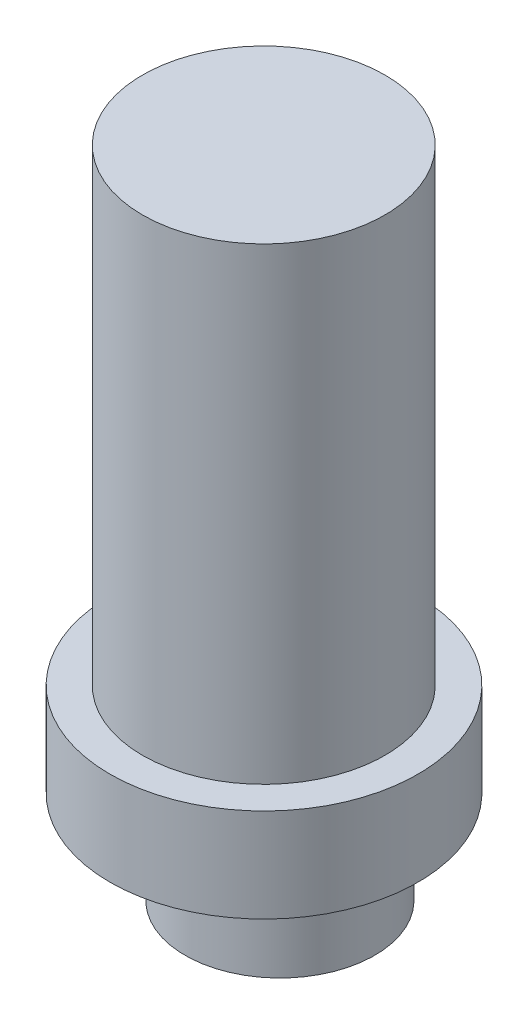
ISO-10303-21;
HEADER;
FILE_DESCRIPTION(('STEP AP214'),'2;1');
FILE_NAME('part.step','',(''),(''),'','','');
FILE_SCHEMA(('AUTOMOTIVE_DESIGN { 1 0 10303 214 1 1 1 1 }'));
ENDSEC;
DATA;
#1=APPLICATION_CONTEXT('core data for automotive mechanical design processes');
#2=APPLICATION_PROTOCOL_DEFINITION('international standard','automotive_design',2000,#1);
#3=PRODUCT_CONTEXT('',#1,'mechanical');
#4=PRODUCT('Part','Part','',(#3));
#5=PRODUCT_RELATED_PRODUCT_CATEGORY('part','',(#4));
#6=PRODUCT_DEFINITION_FORMATION('','',#4);
#7=PRODUCT_DEFINITION_CONTEXT('part definition',#1,'design');
#8=PRODUCT_DEFINITION('design','',#6,#7);
#9=PRODUCT_DEFINITION_SHAPE('','',#8);
#10=(LENGTH_UNIT() NAMED_UNIT(*) SI_UNIT(.MILLI.,.METRE.));
#11=(NAMED_UNIT(*) PLANE_ANGLE_UNIT() SI_UNIT($,.RADIAN.));
#12=(NAMED_UNIT(*) SI_UNIT($,.STERADIAN.) SOLID_ANGLE_UNIT());
#13=UNCERTAINTY_MEASURE_WITH_UNIT(LENGTH_MEASURE(1.E-05),#10,'distance_accuracy_value','');
#14=(GEOMETRIC_REPRESENTATION_CONTEXT(3) GLOBAL_UNCERTAINTY_ASSIGNED_CONTEXT((#13)) GLOBAL_UNIT_ASSIGNED_CONTEXT((#10,
#11,#12)) REPRESENTATION_CONTEXT('',''));
#15=CARTESIAN_POINT('',(0.,0.,0.));
#16=DIRECTION('',(0.,0.,1.));
#17=DIRECTION('',(1.,0.,0.));
#18=AXIS2_PLACEMENT_3D('',#15,#16,#17);
#19=CARTESIAN_POINT('',(0.,10.,-1.80088060511707));
#20=DIRECTION('',(0.,-1.,0.));
#21=DIRECTION('',(0.,0.,-1.));
#22=AXIS2_PLACEMENT_3D('',#19,#20,#21);
#23=CYLINDRICAL_SURFACE('',#22,16.4579037746839);
#24=CARTESIAN_POINT('',(0.,10.,-1.80088060511707));
#25=DIRECTION('',(0.,1.,0.));
#26=DIRECTION('',(0.,0.,1.));
#27=AXIS2_PLACEMENT_3D('',#24,#25,#26);
#28=CIRCLE('',#27,16.4579037746839);
#29=CARTESIAN_POINT('',(0.,10.,14.6570231695668));
#30=VERTEX_POINT('',#29);
#31=EDGE_CURVE('E45',#30,#30,#28,.T.);
#32=ORIENTED_EDGE('',*,*,#31,.F.);
#33=EDGE_LOOP('',(#32));
#34=FACE_BOUND('',#33,.T.);
#35=CARTESIAN_POINT('',(0.,0.,-1.80088060511707));
#36=DIRECTION('',(0.,1.,0.));
#37=DIRECTION('',(0.,0.,1.));
#38=AXIS2_PLACEMENT_3D('',#35,#36,#37);
#39=CIRCLE('',#38,16.4579037746839);
#40=CARTESIAN_POINT('',(0.,0.,14.6570231695668));
#41=VERTEX_POINT('',#40);
#42=EDGE_CURVE('E36',#41,#41,#39,.T.);
#43=ORIENTED_EDGE('',*,*,#42,.T.);
#44=EDGE_LOOP('',(#43));
#45=FACE_BOUND('',#44,.T.);
#46=ADVANCED_FACE('F33',(#34,#45),#23,.T.);
#47=CARTESIAN_POINT('',(0.,10.,-1.80088060511707));
#48=DIRECTION('',(0.,1.,0.));
#49=DIRECTION('',(0.,0.,1.));
#50=AXIS2_PLACEMENT_3D('',#47,#48,#49);
#51=PLANE('',#50);
#52=CARTESIAN_POINT('',(0.,10.,-1.7734498814086));
#53=DIRECTION('',(0.,1.,0.));
#54=DIRECTION('',(0.,0.,1.));
#55=AXIS2_PLACEMENT_3D('',#52,#53,#54);
#56=CIRCLE('',#55,12.9535496853533);
#57=CARTESIAN_POINT('',(0.,10.,11.1800998039447));
#58=VERTEX_POINT('',#57);
#59=EDGE_CURVE('E40',#58,#58,#56,.T.);
#60=ORIENTED_EDGE('',*,*,#59,.F.);
#61=EDGE_LOOP('',(#60));
#62=FACE_BOUND('',#61,.T.);
#63=ORIENTED_EDGE('',*,*,#31,.T.);
#64=EDGE_LOOP('',(#63));
#65=FACE_BOUND('',#64,.T.);
#66=ADVANCED_FACE('F62',(#62,#65),#51,.T.);
#67=CARTESIAN_POINT('',(0.,0.,-1.80088060511707));
#68=DIRECTION('',(0.,1.,0.));
#69=DIRECTION('',(0.,0.,1.));
#70=AXIS2_PLACEMENT_3D('',#67,#68,#69);
#71=PLANE('',#70);
#72=CARTESIAN_POINT('',(0.780000356087385,0.,-2.71849237204869));
#73=DIRECTION('',(0.,-1.,0.));
#74=DIRECTION('',(0.,0.,-1.));
#75=AXIS2_PLACEMENT_3D('',#72,#73,#74);
#76=CIRCLE('',#75,10.1300931899075);
#77=CARTESIAN_POINT('',(0.780000356087385,0.,-12.8485855619562));
#78=VERTEX_POINT('',#77);
#79=EDGE_CURVE('E10',#78,#78,#76,.T.);
#80=ORIENTED_EDGE('',*,*,#79,.F.);
#81=EDGE_LOOP('',(#80));
#82=FACE_BOUND('',#81,.T.);
#83=ORIENTED_EDGE('',*,*,#42,.F.);
#84=EDGE_LOOP('',(#83));
#85=FACE_BOUND('',#84,.T.);
#86=ADVANCED_FACE('F59',(#82,#85),#71,.F.);
#87=CARTESIAN_POINT('',(0.,60.,-1.7734498814086));
#88=DIRECTION('',(0.,-1.,0.));
#89=DIRECTION('',(0.,0.,-1.));
#90=AXIS2_PLACEMENT_3D('',#87,#88,#89);
#91=CYLINDRICAL_SURFACE('',#90,12.9535496853533);
#92=CARTESIAN_POINT('',(0.,60.,-1.7734498814086));
#93=DIRECTION('',(0.,1.,0.));
#94=DIRECTION('',(0.,0.,1.));
#95=AXIS2_PLACEMENT_3D('',#92,#93,#94);
#96=CIRCLE('',#95,12.9535496853533);
#97=CARTESIAN_POINT('',(0.,60.,11.1800998039447));
#98=VERTEX_POINT('',#97);
#99=EDGE_CURVE('E50',#98,#98,#96,.T.);
#100=ORIENTED_EDGE('',*,*,#99,.F.);
#101=EDGE_LOOP('',(#100));
#102=FACE_BOUND('',#101,.T.);
#103=ORIENTED_EDGE('',*,*,#59,.T.);
#104=EDGE_LOOP('',(#103));
#105=FACE_BOUND('',#104,.T.);
#106=ADVANCED_FACE('F61',(#102,#105),#91,.T.);
#107=CARTESIAN_POINT('',(0.,60.,-1.7734498814086));
#108=DIRECTION('',(0.,1.,0.));
#109=DIRECTION('',(0.,0.,1.));
#110=AXIS2_PLACEMENT_3D('',#107,#108,#109);
#111=PLANE('',#110);
#112=ORIENTED_EDGE('',*,*,#99,.T.);
#113=EDGE_LOOP('',(#112));
#114=FACE_BOUND('',#113,.T.);
#115=ADVANCED_FACE('F68',(#114),#111,.T.);
#116=CARTESIAN_POINT('',(0.780000356087385,-10.,-2.71849237204869));
#117=DIRECTION('',(0.,1.,0.));
#118=DIRECTION('',(0.,0.,1.));
#119=AXIS2_PLACEMENT_3D('',#116,#117,#118);
#120=CYLINDRICAL_SURFACE('',#119,10.1300931899075);
#121=CARTESIAN_POINT('',(0.780000356087385,-10.,-2.71849237204869));
#122=DIRECTION('',(0.,-1.,0.));
#123=DIRECTION('',(0.,0.,-1.));
#124=AXIS2_PLACEMENT_3D('',#121,#122,#123);
#125=CIRCLE('',#124,10.1300931899075);
#126=CARTESIAN_POINT('',(0.780000356087385,-10.,-12.8485855619562));
#127=VERTEX_POINT('',#126);
#128=EDGE_CURVE('E49',#127,#127,#125,.T.);
#129=ORIENTED_EDGE('',*,*,#128,.F.);
#130=EDGE_LOOP('',(#129));
#131=FACE_BOUND('',#130,.T.);
#132=ORIENTED_EDGE('',*,*,#79,.T.);
#133=EDGE_LOOP('',(#132));
#134=FACE_BOUND('',#133,.T.);
#135=ADVANCED_FACE('F97',(#131,#134),#120,.T.);
#136=CARTESIAN_POINT('',(0.780000356087385,-10.,-2.71849237204869));
#137=DIRECTION('',(0.,-1.,0.));
#138=DIRECTION('',(0.,0.,-1.));
#139=AXIS2_PLACEMENT_3D('',#136,#137,#138);
#140=PLANE('',#139);
#141=ORIENTED_EDGE('',*,*,#128,.T.);
#142=EDGE_LOOP('',(#141));
#143=FACE_BOUND('',#142,.T.);
#144=ADVANCED_FACE('F111',(#143),#140,.T.);
#145=CLOSED_SHELL('',(#46,#66,#86,#106,#115,#135,#144));
#146=MANIFOLD_SOLID_BREP('B2',#145);
#147=ADVANCED_BREP_SHAPE_REPRESENTATION('',(#18,#146),#14);
#148=SHAPE_DEFINITION_REPRESENTATION(#9,#147);
ENDSEC;
END-ISO-10303-21;
